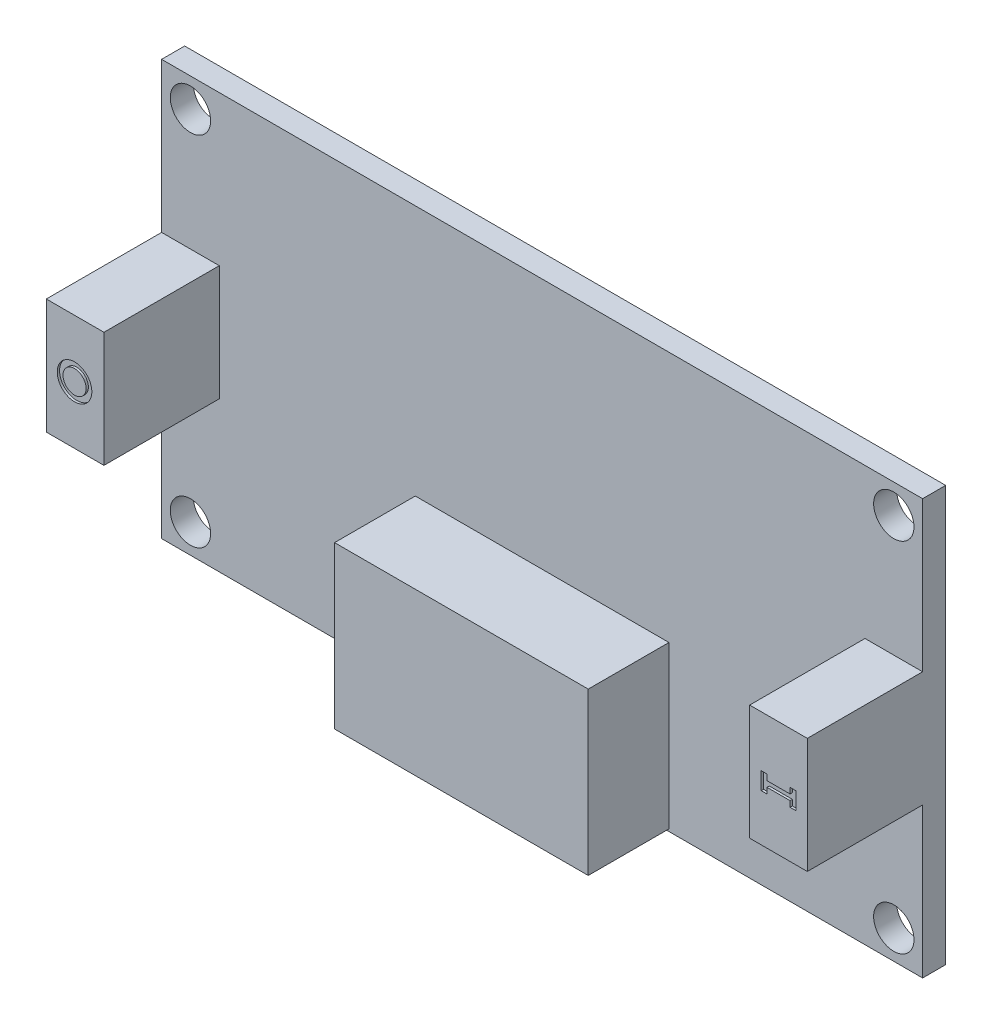
ISO-10303-21;
HEADER;
FILE_DESCRIPTION(('STEP AP214'),'2;1');
FILE_NAME('part.step','',(''),(''),'','','');
FILE_SCHEMA(('AUTOMOTIVE_DESIGN { 1 0 10303 214 1 1 1 1 }'));
ENDSEC;
DATA;
#1=APPLICATION_CONTEXT('core data for automotive mechanical design processes');
#2=APPLICATION_PROTOCOL_DEFINITION('international standard','automotive_design',2000,#1);
#3=PRODUCT_CONTEXT('',#1,'mechanical');
#4=PRODUCT('Part','Part','',(#3));
#5=PRODUCT_RELATED_PRODUCT_CATEGORY('part','',(#4));
#6=PRODUCT_DEFINITION_FORMATION('','',#4);
#7=PRODUCT_DEFINITION_CONTEXT('part definition',#1,'design');
#8=PRODUCT_DEFINITION('design','',#6,#7);
#9=PRODUCT_DEFINITION_SHAPE('','',#8);
#10=(LENGTH_UNIT() NAMED_UNIT(*) SI_UNIT(.MILLI.,.METRE.));
#11=(NAMED_UNIT(*) PLANE_ANGLE_UNIT() SI_UNIT($,.RADIAN.));
#12=(NAMED_UNIT(*) SI_UNIT($,.STERADIAN.) SOLID_ANGLE_UNIT());
#13=UNCERTAINTY_MEASURE_WITH_UNIT(LENGTH_MEASURE(1.E-05),#10,'distance_accuracy_value','');
#14=(GEOMETRIC_REPRESENTATION_CONTEXT(3) GLOBAL_UNCERTAINTY_ASSIGNED_CONTEXT((#13)) GLOBAL_UNIT_ASSIGNED_CONTEXT((#10,
#11,#12)) REPRESENTATION_CONTEXT('',''));
#15=CARTESIAN_POINT('',(0.,0.,0.));
#16=DIRECTION('',(0.,0.,1.));
#17=DIRECTION('',(1.,0.,0.));
#18=AXIS2_PLACEMENT_3D('',#15,#16,#17);
#19=CARTESIAN_POINT('',(0.,0.,2.));
#20=DIRECTION('',(0.,0.,-1.));
#21=DIRECTION('',(-1.,0.,0.));
#22=AXIS2_PLACEMENT_3D('',#19,#20,#21);
#23=PLANE('',#22);
#24=CARTESIAN_POINT('',(-30.5,15.5,2.));
#25=DIRECTION('',(0.,0.,1.));
#26=DIRECTION('',(-1.,0.,0.));
#27=AXIS2_PLACEMENT_3D('',#24,#25,#26);
#28=CIRCLE('',#27,1.75);
#29=CARTESIAN_POINT('',(-32.25,15.5,2.));
#30=VERTEX_POINT('',#29);
#31=EDGE_CURVE('E417',#30,#30,#28,.T.);
#32=ORIENTED_EDGE('',*,*,#31,.F.);
#33=EDGE_LOOP('',(#32));
#34=FACE_BOUND('',#33,.T.);
#35=CARTESIAN_POINT('',(-30.5,-15.5,2.));
#36=DIRECTION('',(0.,0.,1.));
#37=DIRECTION('',(1.,0.,0.));
#38=AXIS2_PLACEMENT_3D('',#35,#36,#37);
#39=CIRCLE('',#38,1.75);
#40=CARTESIAN_POINT('',(-28.75,-15.5,2.));
#41=VERTEX_POINT('',#40);
#42=EDGE_CURVE('E423',#41,#41,#39,.T.);
#43=ORIENTED_EDGE('',*,*,#42,.F.);
#44=EDGE_LOOP('',(#43));
#45=FACE_BOUND('',#44,.T.);
#46=CARTESIAN_POINT('',(30.5,-15.5,2.));
#47=DIRECTION('',(0.,0.,1.));
#48=DIRECTION('',(-1.,0.,0.));
#49=AXIS2_PLACEMENT_3D('',#46,#47,#48);
#50=CIRCLE('',#49,1.75);
#51=CARTESIAN_POINT('',(28.75,-15.5,2.));
#52=VERTEX_POINT('',#51);
#53=EDGE_CURVE('E429',#52,#52,#50,.T.);
#54=ORIENTED_EDGE('',*,*,#53,.F.);
#55=EDGE_LOOP('',(#54));
#56=FACE_BOUND('',#55,.T.);
#57=CARTESIAN_POINT('',(30.5,15.5,2.));
#58=DIRECTION('',(0.,0.,1.));
#59=DIRECTION('',(1.,0.,0.));
#60=AXIS2_PLACEMENT_3D('',#57,#58,#59);
#61=CIRCLE('',#60,1.75);
#62=CARTESIAN_POINT('',(32.25,15.5,2.));
#63=VERTEX_POINT('',#62);
#64=EDGE_CURVE('E435',#63,#63,#61,.T.);
#65=ORIENTED_EDGE('',*,*,#64,.F.);
#66=EDGE_LOOP('',(#65));
#67=FACE_BOUND('',#66,.T.);
#68=DIRECTION('',(0.,1.,0.));
#69=VECTOR('',#68,1.);
#70=CARTESIAN_POINT('',(11.,-17.8,2.));
#71=LINE('',#70,#69);
#72=CARTESIAN_POINT('',(11.,-17.8,2.));
#73=VERTEX_POINT('',#72);
#74=CARTESIAN_POINT('',(11.,-3.79999999999999,2.));
#75=VERTEX_POINT('',#74);
#76=EDGE_CURVE('E383',#73,#75,#71,.T.);
#77=ORIENTED_EDGE('',*,*,#76,.F.);
#78=DIRECTION('',(1.,0.,0.));
#79=VECTOR('',#78,1.);
#80=CARTESIAN_POINT('',(-11.,-17.8,2.));
#81=LINE('',#80,#79);
#82=CARTESIAN_POINT('',(-11.,-17.8,2.));
#83=VERTEX_POINT('',#82);
#84=EDGE_CURVE('E388',#83,#73,#81,.T.);
#85=ORIENTED_EDGE('',*,*,#84,.F.);
#86=DIRECTION('',(0.,-1.,0.));
#87=VECTOR('',#86,1.);
#88=CARTESIAN_POINT('',(-11.,-17.8,2.));
#89=LINE('',#88,#87);
#90=CARTESIAN_POINT('',(-11.,-3.79999999999999,2.));
#91=VERTEX_POINT('',#90);
#92=EDGE_CURVE('E400',#91,#83,#89,.T.);
#93=ORIENTED_EDGE('',*,*,#92,.F.);
#94=DIRECTION('',(-1.,0.,0.));
#95=VECTOR('',#94,1.);
#96=CARTESIAN_POINT('',(-11.,-3.79999999999999,2.));
#97=LINE('',#96,#95);
#98=EDGE_CURVE('E397',#75,#91,#97,.T.);
#99=ORIENTED_EDGE('',*,*,#98,.F.);
#100=EDGE_LOOP('',(#77,#85,#93,#99));
#101=FACE_BOUND('',#100,.T.);
#102=DIRECTION('',(-1.,0.,0.));
#103=VECTOR('',#102,1.);
#104=CARTESIAN_POINT('',(28.,5.,2.));
#105=LINE('',#104,#103);
#106=CARTESIAN_POINT('',(33.,5.,2.));
#107=VERTEX_POINT('',#106);
#108=CARTESIAN_POINT('',(28.,5.,2.));
#109=VERTEX_POINT('',#108);
#110=EDGE_CURVE('E307',#107,#109,#105,.T.);
#111=ORIENTED_EDGE('',*,*,#110,.F.);
#112=DIRECTION('',(0.,1.,0.));
#113=VECTOR('',#112,1.);
#114=CARTESIAN_POINT('',(33.,-18.,2.));
#115=LINE('',#114,#113);
#116=CARTESIAN_POINT('',(33.,18.,2.));
#117=VERTEX_POINT('',#116);
#118=EDGE_CURVE('E444',#107,#117,#115,.T.);
#119=ORIENTED_EDGE('',*,*,#118,.T.);
#120=DIRECTION('',(-1.,0.,0.));
#121=VECTOR('',#120,1.);
#122=CARTESIAN_POINT('',(-33.,18.,2.));
#123=LINE('',#122,#121);
#124=CARTESIAN_POINT('',(-33.,18.,2.));
#125=VERTEX_POINT('',#124);
#126=EDGE_CURVE('E443',#117,#125,#123,.T.);
#127=ORIENTED_EDGE('',*,*,#126,.T.);
#128=DIRECTION('',(0.,-1.,0.));
#129=VECTOR('',#128,1.);
#130=CARTESIAN_POINT('',(-33.,-18.,2.));
#131=LINE('',#130,#129);
#132=CARTESIAN_POINT('',(-33.,5.,2.));
#133=VERTEX_POINT('',#132);
#134=EDGE_CURVE('E447',#125,#133,#131,.T.);
#135=ORIENTED_EDGE('',*,*,#134,.T.);
#136=DIRECTION('',(-1.,0.,0.));
#137=VECTOR('',#136,1.);
#138=CARTESIAN_POINT('',(-33.,5.,2.));
#139=LINE('',#138,#137);
#140=CARTESIAN_POINT('',(-28.,5.,2.));
#141=VERTEX_POINT('',#140);
#142=EDGE_CURVE('E367',#141,#133,#139,.T.);
#143=ORIENTED_EDGE('',*,*,#142,.F.);
#144=DIRECTION('',(0.,1.,0.));
#145=VECTOR('',#144,1.);
#146=CARTESIAN_POINT('',(-28.,5.,2.));
#147=LINE('',#146,#145);
#148=CARTESIAN_POINT('',(-28.,-5.,2.));
#149=VERTEX_POINT('',#148);
#150=EDGE_CURVE('E353',#149,#141,#147,.T.);
#151=ORIENTED_EDGE('',*,*,#150,.F.);
#152=DIRECTION('',(1.,0.,0.));
#153=VECTOR('',#152,1.);
#154=CARTESIAN_POINT('',(-33.,-5.,2.));
#155=LINE('',#154,#153);
#156=CARTESIAN_POINT('',(-33.,-5.,2.));
#157=VERTEX_POINT('',#156);
#158=EDGE_CURVE('E358',#157,#149,#155,.T.);
#159=ORIENTED_EDGE('',*,*,#158,.F.);
#160=CARTESIAN_POINT('',(-33.,-18.,2.));
#161=VERTEX_POINT('',#160);
#162=EDGE_CURVE('E446',#157,#161,#131,.T.);
#163=ORIENTED_EDGE('',*,*,#162,.T.);
#164=DIRECTION('',(1.,0.,0.));
#165=VECTOR('',#164,1.);
#166=CARTESIAN_POINT('',(-33.,-18.,2.));
#167=LINE('',#166,#165);
#168=CARTESIAN_POINT('',(33.,-18.,2.));
#169=VERTEX_POINT('',#168);
#170=EDGE_CURVE('E449',#161,#169,#167,.T.);
#171=ORIENTED_EDGE('',*,*,#170,.T.);
#172=CARTESIAN_POINT('',(33.,-5.,2.));
#173=VERTEX_POINT('',#172);
#174=EDGE_CURVE('E441',#169,#173,#115,.T.);
#175=ORIENTED_EDGE('',*,*,#174,.T.);
#176=DIRECTION('',(1.,0.,0.));
#177=VECTOR('',#176,1.);
#178=CARTESIAN_POINT('',(28.,-5.,2.));
#179=LINE('',#178,#177);
#180=CARTESIAN_POINT('',(28.,-5.,2.));
#181=VERTEX_POINT('',#180);
#182=EDGE_CURVE('E331',#181,#173,#179,.T.);
#183=ORIENTED_EDGE('',*,*,#182,.F.);
#184=DIRECTION('',(0.,-1.,0.));
#185=VECTOR('',#184,1.);
#186=CARTESIAN_POINT('',(28.,5.,2.));
#187=LINE('',#186,#185);
#188=EDGE_CURVE('E57',#109,#181,#187,.T.);
#189=ORIENTED_EDGE('',*,*,#188,.F.);
#190=EDGE_LOOP('',(#111,#119,#127,#135,#143,#151,#159,#163,#171,#175,#183,#189));
#191=FACE_BOUND('',#190,.T.);
#192=ADVANCED_FACE('F34',(#34,#45,#56,#67,#101,#191),#23,.F.);
#193=CARTESIAN_POINT('',(0.,0.,0.));
#194=DIRECTION('',(0.,0.,-1.));
#195=DIRECTION('',(-1.,0.,0.));
#196=AXIS2_PLACEMENT_3D('',#193,#194,#195);
#197=PLANE('',#196);
#198=CARTESIAN_POINT('',(-30.5,-15.5,0.));
#199=DIRECTION('',(0.,0.,1.));
#200=DIRECTION('',(1.,0.,0.));
#201=AXIS2_PLACEMENT_3D('',#198,#199,#200);
#202=CIRCLE('',#201,1.75);
#203=CARTESIAN_POINT('',(-28.75,-15.5,0.));
#204=VERTEX_POINT('',#203);
#205=EDGE_CURVE('E420',#204,#204,#202,.T.);
#206=ORIENTED_EDGE('',*,*,#205,.T.);
#207=EDGE_LOOP('',(#206));
#208=FACE_BOUND('',#207,.T.);
#209=CARTESIAN_POINT('',(30.5,15.5,0.));
#210=DIRECTION('',(0.,0.,1.));
#211=DIRECTION('',(1.,0.,0.));
#212=AXIS2_PLACEMENT_3D('',#209,#210,#211);
#213=CIRCLE('',#212,1.75);
#214=CARTESIAN_POINT('',(32.25,15.5,0.));
#215=VERTEX_POINT('',#214);
#216=EDGE_CURVE('E432',#215,#215,#213,.T.);
#217=ORIENTED_EDGE('',*,*,#216,.T.);
#218=EDGE_LOOP('',(#217));
#219=FACE_BOUND('',#218,.T.);
#220=DIRECTION('',(0.,1.,0.));
#221=VECTOR('',#220,1.);
#222=CARTESIAN_POINT('',(33.,-18.,0.));
#223=LINE('',#222,#221);
#224=CARTESIAN_POINT('',(33.,-18.,0.));
#225=VERTEX_POINT('',#224);
#226=CARTESIAN_POINT('',(33.,18.,0.));
#227=VERTEX_POINT('',#226);
#228=EDGE_CURVE('E438',#225,#227,#223,.T.);
#229=ORIENTED_EDGE('',*,*,#228,.F.);
#230=DIRECTION('',(1.,0.,0.));
#231=VECTOR('',#230,1.);
#232=CARTESIAN_POINT('',(-33.,-18.,0.));
#233=LINE('',#232,#231);
#234=CARTESIAN_POINT('',(-33.,-18.,0.));
#235=VERTEX_POINT('',#234);
#236=EDGE_CURVE('E458',#235,#225,#233,.T.);
#237=ORIENTED_EDGE('',*,*,#236,.F.);
#238=DIRECTION('',(0.,-1.,0.));
#239=VECTOR('',#238,1.);
#240=CARTESIAN_POINT('',(-33.,-18.,0.));
#241=LINE('',#240,#239);
#242=CARTESIAN_POINT('',(-33.,18.,0.));
#243=VERTEX_POINT('',#242);
#244=EDGE_CURVE('E456',#243,#235,#241,.T.);
#245=ORIENTED_EDGE('',*,*,#244,.F.);
#246=DIRECTION('',(-1.,0.,0.));
#247=VECTOR('',#246,1.);
#248=CARTESIAN_POINT('',(-33.,18.,0.));
#249=LINE('',#248,#247);
#250=EDGE_CURVE('E454',#227,#243,#249,.T.);
#251=ORIENTED_EDGE('',*,*,#250,.F.);
#252=EDGE_LOOP('',(#229,#237,#245,#251));
#253=FACE_BOUND('',#252,.T.);
#254=CARTESIAN_POINT('',(30.5,-15.5,0.));
#255=DIRECTION('',(0.,0.,1.));
#256=DIRECTION('',(-1.,0.,0.));
#257=AXIS2_PLACEMENT_3D('',#254,#255,#256);
#258=CIRCLE('',#257,1.75);
#259=CARTESIAN_POINT('',(28.75,-15.5,0.));
#260=VERTEX_POINT('',#259);
#261=EDGE_CURVE('E426',#260,#260,#258,.T.);
#262=ORIENTED_EDGE('',*,*,#261,.T.);
#263=EDGE_LOOP('',(#262));
#264=FACE_BOUND('',#263,.T.);
#265=CARTESIAN_POINT('',(-30.5,15.5,0.));
#266=DIRECTION('',(0.,0.,1.));
#267=DIRECTION('',(-1.,0.,0.));
#268=AXIS2_PLACEMENT_3D('',#265,#266,#267);
#269=CIRCLE('',#268,1.75);
#270=CARTESIAN_POINT('',(-32.25,15.5,0.));
#271=VERTEX_POINT('',#270);
#272=EDGE_CURVE('E416',#271,#271,#269,.T.);
#273=ORIENTED_EDGE('',*,*,#272,.T.);
#274=EDGE_LOOP('',(#273));
#275=FACE_BOUND('',#274,.T.);
#276=ADVANCED_FACE('F476',(#208,#219,#253,#264,#275),#197,.T.);
#277=CARTESIAN_POINT('',(33.,-18.,2.));
#278=DIRECTION('',(-1.,0.,0.));
#279=DIRECTION('',(0.,0.,1.));
#280=AXIS2_PLACEMENT_3D('',#277,#278,#279);
#281=PLANE('',#280);
#282=ORIENTED_EDGE('',*,*,#228,.T.);
#283=DIRECTION('',(0.,0.,-1.));
#284=VECTOR('',#283,1.);
#285=CARTESIAN_POINT('',(33.,18.,2.));
#286=LINE('',#285,#284);
#287=EDGE_CURVE('E11',#117,#227,#286,.T.);
#288=ORIENTED_EDGE('',*,*,#287,.F.);
#289=ORIENTED_EDGE('',*,*,#118,.F.);
#290=DIRECTION('',(0.,0.,-1.));
#291=VECTOR('',#290,1.);
#292=CARTESIAN_POINT('',(33.,5.,12.));
#293=LINE('',#292,#291);
#294=CARTESIAN_POINT('',(33.,5.,12.));
#295=VERTEX_POINT('',#294);
#296=EDGE_CURVE('E350',#295,#107,#293,.T.);
#297=ORIENTED_EDGE('',*,*,#296,.F.);
#298=DIRECTION('',(0.,1.,0.));
#299=VECTOR('',#298,1.);
#300=CARTESIAN_POINT('',(33.,5.,12.));
#301=LINE('',#300,#299);
#302=CARTESIAN_POINT('',(33.,-5.,12.));
#303=VERTEX_POINT('',#302);
#304=EDGE_CURVE('E327',#303,#295,#301,.T.);
#305=ORIENTED_EDGE('',*,*,#304,.F.);
#306=DIRECTION('',(0.,0.,-1.));
#307=VECTOR('',#306,1.);
#308=CARTESIAN_POINT('',(33.,-5.,12.));
#309=LINE('',#308,#307);
#310=EDGE_CURVE('E337',#303,#173,#309,.T.);
#311=ORIENTED_EDGE('',*,*,#310,.T.);
#312=ORIENTED_EDGE('',*,*,#174,.F.);
#313=DIRECTION('',(0.,0.,-1.));
#314=VECTOR('',#313,1.);
#315=CARTESIAN_POINT('',(33.,-18.,2.));
#316=LINE('',#315,#314);
#317=EDGE_CURVE('E451',#169,#225,#316,.T.);
#318=ORIENTED_EDGE('',*,*,#317,.T.);
#319=EDGE_LOOP('',(#282,#288,#289,#297,#305,#311,#312,#318));
#320=FACE_BOUND('',#319,.T.);
#321=ADVANCED_FACE('F36',(#320),#281,.F.);
#322=CARTESIAN_POINT('',(-33.,18.,2.));
#323=DIRECTION('',(0.,-1.,0.));
#324=DIRECTION('',(0.,0.,-1.));
#325=AXIS2_PLACEMENT_3D('',#322,#323,#324);
#326=PLANE('',#325);
#327=ORIENTED_EDGE('',*,*,#250,.T.);
#328=DIRECTION('',(0.,0.,-1.));
#329=VECTOR('',#328,1.);
#330=CARTESIAN_POINT('',(-33.,18.,2.));
#331=LINE('',#330,#329);
#332=EDGE_CURVE('E42',#125,#243,#331,.T.);
#333=ORIENTED_EDGE('',*,*,#332,.F.);
#334=ORIENTED_EDGE('',*,*,#126,.F.);
#335=ORIENTED_EDGE('',*,*,#287,.T.);
#336=EDGE_LOOP('',(#327,#333,#334,#335));
#337=FACE_BOUND('',#336,.T.);
#338=ADVANCED_FACE('F498',(#337),#326,.F.);
#339=CARTESIAN_POINT('',(-33.,-18.,2.));
#340=DIRECTION('',(1.,0.,0.));
#341=DIRECTION('',(0.,0.,-1.));
#342=AXIS2_PLACEMENT_3D('',#339,#340,#341);
#343=PLANE('',#342);
#344=ORIENTED_EDGE('',*,*,#244,.T.);
#345=DIRECTION('',(0.,0.,-1.));
#346=VECTOR('',#345,1.);
#347=CARTESIAN_POINT('',(-33.,-18.,2.));
#348=LINE('',#347,#346);
#349=EDGE_CURVE('E462',#161,#235,#348,.T.);
#350=ORIENTED_EDGE('',*,*,#349,.F.);
#351=ORIENTED_EDGE('',*,*,#162,.F.);
#352=DIRECTION('',(0.,0.,-1.));
#353=VECTOR('',#352,1.);
#354=CARTESIAN_POINT('',(-33.,-5.,12.));
#355=LINE('',#354,#353);
#356=CARTESIAN_POINT('',(-33.,-5.,12.));
#357=VERTEX_POINT('',#356);
#358=EDGE_CURVE('E374',#357,#157,#355,.T.);
#359=ORIENTED_EDGE('',*,*,#358,.F.);
#360=DIRECTION('',(0.,-1.,0.));
#361=VECTOR('',#360,1.);
#362=CARTESIAN_POINT('',(-33.,5.,12.));
#363=LINE('',#362,#361);
#364=CARTESIAN_POINT('',(-33.,5.,12.));
#365=VERTEX_POINT('',#364);
#366=EDGE_CURVE('E360',#365,#357,#363,.T.);
#367=ORIENTED_EDGE('',*,*,#366,.F.);
#368=DIRECTION('',(0.,0.,-1.));
#369=VECTOR('',#368,1.);
#370=CARTESIAN_POINT('',(-33.,5.,12.));
#371=LINE('',#370,#369);
#372=EDGE_CURVE('E377',#365,#133,#371,.T.);
#373=ORIENTED_EDGE('',*,*,#372,.T.);
#374=ORIENTED_EDGE('',*,*,#134,.F.);
#375=ORIENTED_EDGE('',*,*,#332,.T.);
#376=EDGE_LOOP('',(#344,#350,#351,#359,#367,#373,#374,#375));
#377=FACE_BOUND('',#376,.T.);
#378=ADVANCED_FACE('F469',(#377),#343,.F.);
#379=CARTESIAN_POINT('',(-33.,-18.,2.));
#380=DIRECTION('',(0.,1.,0.));
#381=DIRECTION('',(0.,0.,1.));
#382=AXIS2_PLACEMENT_3D('',#379,#380,#381);
#383=PLANE('',#382);
#384=ORIENTED_EDGE('',*,*,#236,.T.);
#385=ORIENTED_EDGE('',*,*,#317,.F.);
#386=ORIENTED_EDGE('',*,*,#170,.F.);
#387=ORIENTED_EDGE('',*,*,#349,.T.);
#388=EDGE_LOOP('',(#384,#385,#386,#387));
#389=FACE_BOUND('',#388,.T.);
#390=ADVANCED_FACE('F480',(#389),#383,.F.);
#391=CARTESIAN_POINT('',(30.5,15.5,2.));
#392=DIRECTION('',(0.,0.,-1.));
#393=DIRECTION('',(-1.,0.,0.));
#394=AXIS2_PLACEMENT_3D('',#391,#392,#393);
#395=CYLINDRICAL_SURFACE('',#394,1.75);
#396=ORIENTED_EDGE('',*,*,#64,.T.);
#397=EDGE_LOOP('',(#396));
#398=FACE_BOUND('',#397,.T.);
#399=ORIENTED_EDGE('',*,*,#216,.F.);
#400=EDGE_LOOP('',(#399));
#401=FACE_BOUND('',#400,.T.);
#402=ADVANCED_FACE('F516',(#398,#401),#395,.F.);
#403=CARTESIAN_POINT('',(30.5,-15.5,2.));
#404=DIRECTION('',(0.,0.,-1.));
#405=DIRECTION('',(-1.,0.,0.));
#406=AXIS2_PLACEMENT_3D('',#403,#404,#405);
#407=CYLINDRICAL_SURFACE('',#406,1.75);
#408=ORIENTED_EDGE('',*,*,#53,.T.);
#409=EDGE_LOOP('',(#408));
#410=FACE_BOUND('',#409,.T.);
#411=ORIENTED_EDGE('',*,*,#261,.F.);
#412=EDGE_LOOP('',(#411));
#413=FACE_BOUND('',#412,.T.);
#414=ADVANCED_FACE('F523',(#410,#413),#407,.F.);
#415=CARTESIAN_POINT('',(-30.5,-15.5,2.));
#416=DIRECTION('',(0.,0.,-1.));
#417=DIRECTION('',(-1.,0.,0.));
#418=AXIS2_PLACEMENT_3D('',#415,#416,#417);
#419=CYLINDRICAL_SURFACE('',#418,1.75);
#420=ORIENTED_EDGE('',*,*,#42,.T.);
#421=EDGE_LOOP('',(#420));
#422=FACE_BOUND('',#421,.T.);
#423=ORIENTED_EDGE('',*,*,#205,.F.);
#424=EDGE_LOOP('',(#423));
#425=FACE_BOUND('',#424,.T.);
#426=ADVANCED_FACE('F528',(#422,#425),#419,.F.);
#427=CARTESIAN_POINT('',(-30.5,15.5,2.));
#428=DIRECTION('',(0.,0.,-1.));
#429=DIRECTION('',(-1.,0.,0.));
#430=AXIS2_PLACEMENT_3D('',#427,#428,#429);
#431=CYLINDRICAL_SURFACE('',#430,1.75);
#432=ORIENTED_EDGE('',*,*,#31,.T.);
#433=EDGE_LOOP('',(#432));
#434=FACE_BOUND('',#433,.T.);
#435=ORIENTED_EDGE('',*,*,#272,.F.);
#436=EDGE_LOOP('',(#435));
#437=FACE_BOUND('',#436,.T.);
#438=ADVANCED_FACE('F560',(#434,#437),#431,.F.);
#439=CARTESIAN_POINT('',(11.,-17.8,9.));
#440=DIRECTION('',(-1.,0.,0.));
#441=DIRECTION('',(0.,0.,1.));
#442=AXIS2_PLACEMENT_3D('',#439,#440,#441);
#443=PLANE('',#442);
#444=ORIENTED_EDGE('',*,*,#76,.T.);
#445=DIRECTION('',(0.,0.,-1.));
#446=VECTOR('',#445,1.);
#447=CARTESIAN_POINT('',(11.,-3.79999999999999,9.));
#448=LINE('',#447,#446);
#449=CARTESIAN_POINT('',(11.,-3.79999999999999,9.));
#450=VERTEX_POINT('',#449);
#451=EDGE_CURVE('E413',#450,#75,#448,.T.);
#452=ORIENTED_EDGE('',*,*,#451,.F.);
#453=DIRECTION('',(0.,1.,0.));
#454=VECTOR('',#453,1.);
#455=CARTESIAN_POINT('',(11.,-17.8,9.));
#456=LINE('',#455,#454);
#457=CARTESIAN_POINT('',(11.,-17.8,9.));
#458=VERTEX_POINT('',#457);
#459=EDGE_CURVE('E384',#458,#450,#456,.T.);
#460=ORIENTED_EDGE('',*,*,#459,.F.);
#461=DIRECTION('',(0.,0.,-1.));
#462=VECTOR('',#461,1.);
#463=CARTESIAN_POINT('',(11.,-17.8,9.));
#464=LINE('',#463,#462);
#465=EDGE_CURVE('E394',#458,#73,#464,.T.);
#466=ORIENTED_EDGE('',*,*,#465,.T.);
#467=EDGE_LOOP('',(#444,#452,#460,#466));
#468=FACE_BOUND('',#467,.T.);
#469=ADVANCED_FACE('F544',(#468),#443,.F.);
#470=CARTESIAN_POINT('',(-11.,-3.79999999999999,9.));
#471=DIRECTION('',(0.,-1.,0.));
#472=DIRECTION('',(0.,0.,-1.));
#473=AXIS2_PLACEMENT_3D('',#470,#471,#472);
#474=PLANE('',#473);
#475=ORIENTED_EDGE('',*,*,#98,.T.);
#476=DIRECTION('',(0.,0.,-1.));
#477=VECTOR('',#476,1.);
#478=CARTESIAN_POINT('',(-11.,-3.79999999999999,9.));
#479=LINE('',#478,#477);
#480=CARTESIAN_POINT('',(-11.,-3.79999999999999,9.));
#481=VERTEX_POINT('',#480);
#482=EDGE_CURVE('E410',#481,#91,#479,.T.);
#483=ORIENTED_EDGE('',*,*,#482,.F.);
#484=DIRECTION('',(-1.,0.,0.));
#485=VECTOR('',#484,1.);
#486=CARTESIAN_POINT('',(-11.,-3.79999999999999,9.));
#487=LINE('',#486,#485);
#488=EDGE_CURVE('E387',#450,#481,#487,.T.);
#489=ORIENTED_EDGE('',*,*,#488,.F.);
#490=ORIENTED_EDGE('',*,*,#451,.T.);
#491=EDGE_LOOP('',(#475,#483,#489,#490));
#492=FACE_BOUND('',#491,.T.);
#493=ADVANCED_FACE('F552',(#492),#474,.F.);
#494=CARTESIAN_POINT('',(-11.,-17.8,9.));
#495=DIRECTION('',(1.,0.,0.));
#496=DIRECTION('',(0.,0.,-1.));
#497=AXIS2_PLACEMENT_3D('',#494,#495,#496);
#498=PLANE('',#497);
#499=ORIENTED_EDGE('',*,*,#92,.T.);
#500=DIRECTION('',(0.,0.,-1.));
#501=VECTOR('',#500,1.);
#502=CARTESIAN_POINT('',(-11.,-17.8,9.));
#503=LINE('',#502,#501);
#504=CARTESIAN_POINT('',(-11.,-17.8,9.));
#505=VERTEX_POINT('',#504);
#506=EDGE_CURVE('E407',#505,#83,#503,.T.);
#507=ORIENTED_EDGE('',*,*,#506,.F.);
#508=DIRECTION('',(0.,-1.,0.));
#509=VECTOR('',#508,1.);
#510=CARTESIAN_POINT('',(-11.,-17.8,9.));
#511=LINE('',#510,#509);
#512=EDGE_CURVE('E390',#481,#505,#511,.T.);
#513=ORIENTED_EDGE('',*,*,#512,.F.);
#514=ORIENTED_EDGE('',*,*,#482,.T.);
#515=EDGE_LOOP('',(#499,#507,#513,#514));
#516=FACE_BOUND('',#515,.T.);
#517=ADVANCED_FACE('F550',(#516),#498,.F.);
#518=CARTESIAN_POINT('',(-11.,-17.8,9.));
#519=DIRECTION('',(0.,1.,0.));
#520=DIRECTION('',(0.,0.,1.));
#521=AXIS2_PLACEMENT_3D('',#518,#519,#520);
#522=PLANE('',#521);
#523=ORIENTED_EDGE('',*,*,#84,.T.);
#524=ORIENTED_EDGE('',*,*,#465,.F.);
#525=DIRECTION('',(1.,0.,0.));
#526=VECTOR('',#525,1.);
#527=CARTESIAN_POINT('',(-11.,-17.8,9.));
#528=LINE('',#527,#526);
#529=EDGE_CURVE('E392',#505,#458,#528,.T.);
#530=ORIENTED_EDGE('',*,*,#529,.F.);
#531=ORIENTED_EDGE('',*,*,#506,.T.);
#532=EDGE_LOOP('',(#523,#524,#530,#531));
#533=FACE_BOUND('',#532,.T.);
#534=ADVANCED_FACE('F540',(#533),#522,.F.);
#535=CARTESIAN_POINT('',(0.,0.,9.));
#536=DIRECTION('',(0.,0.,-1.));
#537=DIRECTION('',(-1.,0.,0.));
#538=AXIS2_PLACEMENT_3D('',#535,#536,#537);
#539=PLANE('',#538);
#540=ORIENTED_EDGE('',*,*,#459,.T.);
#541=ORIENTED_EDGE('',*,*,#488,.T.);
#542=ORIENTED_EDGE('',*,*,#512,.T.);
#543=ORIENTED_EDGE('',*,*,#529,.T.);
#544=EDGE_LOOP('',(#540,#541,#542,#543));
#545=FACE_BOUND('',#544,.T.);
#546=ADVANCED_FACE('F546',(#545),#539,.F.);
#547=CARTESIAN_POINT('',(-28.,5.,12.));
#548=DIRECTION('',(-1.,0.,0.));
#549=DIRECTION('',(0.,0.,1.));
#550=AXIS2_PLACEMENT_3D('',#547,#548,#549);
#551=PLANE('',#550);
#552=ORIENTED_EDGE('',*,*,#150,.T.);
#553=DIRECTION('',(0.,0.,-1.));
#554=VECTOR('',#553,1.);
#555=CARTESIAN_POINT('',(-28.,5.,12.));
#556=LINE('',#555,#554);
#557=CARTESIAN_POINT('',(-28.,5.,12.));
#558=VERTEX_POINT('',#557);
#559=EDGE_CURVE('E380',#558,#141,#556,.T.);
#560=ORIENTED_EDGE('',*,*,#559,.F.);
#561=DIRECTION('',(0.,1.,0.));
#562=VECTOR('',#561,1.);
#563=CARTESIAN_POINT('',(-28.,5.,12.));
#564=LINE('',#563,#562);
#565=CARTESIAN_POINT('',(-28.,-5.,12.));
#566=VERTEX_POINT('',#565);
#567=EDGE_CURVE('E354',#566,#558,#564,.T.);
#568=ORIENTED_EDGE('',*,*,#567,.F.);
#569=DIRECTION('',(0.,0.,-1.));
#570=VECTOR('',#569,1.);
#571=CARTESIAN_POINT('',(-28.,-5.,12.));
#572=LINE('',#571,#570);
#573=EDGE_CURVE('E364',#566,#149,#572,.T.);
#574=ORIENTED_EDGE('',*,*,#573,.T.);
#575=EDGE_LOOP('',(#552,#560,#568,#574));
#576=FACE_BOUND('',#575,.T.);
#577=ADVANCED_FACE('F616',(#576),#551,.F.);
#578=CARTESIAN_POINT('',(-33.,5.,12.));
#579=DIRECTION('',(0.,-1.,0.));
#580=DIRECTION('',(0.,0.,-1.));
#581=AXIS2_PLACEMENT_3D('',#578,#579,#580);
#582=PLANE('',#581);
#583=ORIENTED_EDGE('',*,*,#142,.T.);
#584=ORIENTED_EDGE('',*,*,#372,.F.);
#585=DIRECTION('',(-1.,0.,0.));
#586=VECTOR('',#585,1.);
#587=CARTESIAN_POINT('',(-33.,5.,12.));
#588=LINE('',#587,#586);
#589=EDGE_CURVE('E357',#558,#365,#588,.T.);
#590=ORIENTED_EDGE('',*,*,#589,.F.);
#591=ORIENTED_EDGE('',*,*,#559,.T.);
#592=EDGE_LOOP('',(#583,#584,#590,#591));
#593=FACE_BOUND('',#592,.T.);
#594=ADVANCED_FACE('F644',(#593),#582,.F.);
#595=CARTESIAN_POINT('',(-33.,-5.,12.));
#596=DIRECTION('',(0.,1.,0.));
#597=DIRECTION('',(0.,0.,1.));
#598=AXIS2_PLACEMENT_3D('',#595,#596,#597);
#599=PLANE('',#598);
#600=ORIENTED_EDGE('',*,*,#158,.T.);
#601=ORIENTED_EDGE('',*,*,#573,.F.);
#602=DIRECTION('',(1.,0.,0.));
#603=VECTOR('',#602,1.);
#604=CARTESIAN_POINT('',(-33.,-5.,12.));
#605=LINE('',#604,#603);
#606=EDGE_CURVE('E362',#357,#566,#605,.T.);
#607=ORIENTED_EDGE('',*,*,#606,.F.);
#608=ORIENTED_EDGE('',*,*,#358,.T.);
#609=EDGE_LOOP('',(#600,#601,#607,#608));
#610=FACE_BOUND('',#609,.T.);
#611=ADVANCED_FACE('F654',(#610),#599,.F.);
#612=CARTESIAN_POINT('',(0.,0.,12.));
#613=DIRECTION('',(0.,0.,1.));
#614=DIRECTION('',(1.,0.,0.));
#615=AXIS2_PLACEMENT_3D('',#612,#613,#614);
#616=PLANE('',#615);
#617=CARTESIAN_POINT('',(-30.5516184550516,0.,12.));
#618=DIRECTION('',(0.,0.,1.));
#619=DIRECTION('',(1.,0.,0.));
#620=AXIS2_PLACEMENT_3D('',#617,#618,#619);
#621=CIRCLE('',#620,1.5);
#622=CARTESIAN_POINT('',(-29.0516184550516,0.,12.));
#623=VERTEX_POINT('',#622);
#624=EDGE_CURVE('E247',#623,#623,#621,.T.);
#625=ORIENTED_EDGE('',*,*,#624,.F.);
#626=EDGE_LOOP('',(#625));
#627=FACE_BOUND('',#626,.T.);
#628=ORIENTED_EDGE('',*,*,#567,.T.);
#629=ORIENTED_EDGE('',*,*,#589,.T.);
#630=ORIENTED_EDGE('',*,*,#366,.T.);
#631=ORIENTED_EDGE('',*,*,#606,.T.);
#632=EDGE_LOOP('',(#628,#629,#630,#631));
#633=FACE_BOUND('',#632,.T.);
#634=ADVANCED_FACE('F664',(#627,#633),#616,.T.);
#635=CARTESIAN_POINT('',(28.,5.,12.));
#636=DIRECTION('',(0.,-1.,0.));
#637=DIRECTION('',(0.,0.,-1.));
#638=AXIS2_PLACEMENT_3D('',#635,#636,#637);
#639=PLANE('',#638);
#640=ORIENTED_EDGE('',*,*,#110,.T.);
#641=DIRECTION('',(0.,0.,-1.));
#642=VECTOR('',#641,1.);
#643=CARTESIAN_POINT('',(28.,5.,12.));
#644=LINE('',#643,#642);
#645=CARTESIAN_POINT('',(28.,5.,12.));
#646=VERTEX_POINT('',#645);
#647=EDGE_CURVE('E347',#646,#109,#644,.T.);
#648=ORIENTED_EDGE('',*,*,#647,.F.);
#649=DIRECTION('',(-1.,0.,0.));
#650=VECTOR('',#649,1.);
#651=CARTESIAN_POINT('',(28.,5.,12.));
#652=LINE('',#651,#650);
#653=EDGE_CURVE('E330',#295,#646,#652,.T.);
#654=ORIENTED_EDGE('',*,*,#653,.F.);
#655=ORIENTED_EDGE('',*,*,#296,.T.);
#656=EDGE_LOOP('',(#640,#648,#654,#655));
#657=FACE_BOUND('',#656,.T.);
#658=ADVANCED_FACE('F496',(#657),#639,.F.);
#659=CARTESIAN_POINT('',(28.,5.,12.));
#660=DIRECTION('',(1.,0.,0.));
#661=DIRECTION('',(0.,0.,-1.));
#662=AXIS2_PLACEMENT_3D('',#659,#660,#661);
#663=PLANE('',#662);
#664=ORIENTED_EDGE('',*,*,#188,.T.);
#665=DIRECTION('',(0.,0.,-1.));
#666=VECTOR('',#665,1.);
#667=CARTESIAN_POINT('',(28.,-5.,12.));
#668=LINE('',#667,#666);
#669=CARTESIAN_POINT('',(28.,-5.,12.));
#670=VERTEX_POINT('',#669);
#671=EDGE_CURVE('E344',#670,#181,#668,.T.);
#672=ORIENTED_EDGE('',*,*,#671,.F.);
#673=DIRECTION('',(0.,-1.,0.));
#674=VECTOR('',#673,1.);
#675=CARTESIAN_POINT('',(28.,5.,12.));
#676=LINE('',#675,#674);
#677=EDGE_CURVE('E333',#646,#670,#676,.T.);
#678=ORIENTED_EDGE('',*,*,#677,.F.);
#679=ORIENTED_EDGE('',*,*,#647,.T.);
#680=EDGE_LOOP('',(#664,#672,#678,#679));
#681=FACE_BOUND('',#680,.T.);
#682=ADVANCED_FACE('F493',(#681),#663,.F.);
#683=CARTESIAN_POINT('',(28.,-5.,12.));
#684=DIRECTION('',(0.,1.,0.));
#685=DIRECTION('',(0.,0.,1.));
#686=AXIS2_PLACEMENT_3D('',#683,#684,#685);
#687=PLANE('',#686);
#688=ORIENTED_EDGE('',*,*,#182,.T.);
#689=ORIENTED_EDGE('',*,*,#310,.F.);
#690=DIRECTION('',(1.,0.,0.));
#691=VECTOR('',#690,1.);
#692=CARTESIAN_POINT('',(28.,-5.,12.));
#693=LINE('',#692,#691);
#694=EDGE_CURVE('E335',#670,#303,#693,.T.);
#695=ORIENTED_EDGE('',*,*,#694,.F.);
#696=ORIENTED_EDGE('',*,*,#671,.T.);
#697=EDGE_LOOP('',(#688,#689,#695,#696));
#698=FACE_BOUND('',#697,.T.);
#699=ADVANCED_FACE('F488',(#698),#687,.F.);
#700=CARTESIAN_POINT('',(0.,0.,12.));
#701=DIRECTION('',(0.,0.,1.));
#702=DIRECTION('',(1.,0.,0.));
#703=AXIS2_PLACEMENT_3D('',#700,#701,#702);
#704=PLANE('',#703);
#705=DIRECTION('',(1.,0.,0.));
#706=VECTOR('',#705,1.);
#707=CARTESIAN_POINT('',(29.,-0.928585990765839,12.));
#708=LINE('',#707,#706);
#709=CARTESIAN_POINT('',(29.,-0.928585990765839,12.));
#710=VERTEX_POINT('',#709);
#711=CARTESIAN_POINT('',(29.5,-0.928585990765839,12.));
#712=VERTEX_POINT('',#711);
#713=EDGE_CURVE('E49',#710,#712,#708,.T.);
#714=ORIENTED_EDGE('',*,*,#713,.F.);
#715=DIRECTION('',(0.,-1.,0.));
#716=VECTOR('',#715,1.);
#717=CARTESIAN_POINT('',(29.,0.571414009234161,12.));
#718=LINE('',#717,#716);
#719=CARTESIAN_POINT('',(29.,0.571414009234161,12.));
#720=VERTEX_POINT('',#719);
#721=EDGE_CURVE('E241',#720,#710,#718,.T.);
#722=ORIENTED_EDGE('',*,*,#721,.F.);
#723=DIRECTION('',(-1.,0.,0.));
#724=VECTOR('',#723,1.);
#725=CARTESIAN_POINT('',(29.5,0.571414009234161,12.));
#726=LINE('',#725,#724);
#727=CARTESIAN_POINT('',(29.5,0.571414009234161,12.));
#728=VERTEX_POINT('',#727);
#729=EDGE_CURVE('E244',#728,#720,#726,.T.);
#730=ORIENTED_EDGE('',*,*,#729,.F.);
#731=DIRECTION('',(0.,1.,0.));
#732=VECTOR('',#731,1.);
#733=CARTESIAN_POINT('',(29.5,0.0714140092341609,12.));
#734=LINE('',#733,#732);
#735=CARTESIAN_POINT('',(29.5,0.0714140092341609,12.));
#736=VERTEX_POINT('',#735);
#737=EDGE_CURVE('E300',#736,#728,#734,.T.);
#738=ORIENTED_EDGE('',*,*,#737,.F.);
#739=DIRECTION('',(-1.,0.,0.));
#740=VECTOR('',#739,1.);
#741=CARTESIAN_POINT('',(31.5,0.0714140092341611,12.));
#742=LINE('',#741,#740);
#743=CARTESIAN_POINT('',(31.5,0.0714140092341611,12.));
#744=VERTEX_POINT('',#743);
#745=EDGE_CURVE('E297',#744,#736,#742,.T.);
#746=ORIENTED_EDGE('',*,*,#745,.F.);
#747=DIRECTION('',(0.,-1.,0.));
#748=VECTOR('',#747,1.);
#749=CARTESIAN_POINT('',(31.5,0.571414009234162,12.));
#750=LINE('',#749,#748);
#751=CARTESIAN_POINT('',(31.5,0.571414009234162,12.));
#752=VERTEX_POINT('',#751);
#753=EDGE_CURVE('E294',#752,#744,#750,.T.);
#754=ORIENTED_EDGE('',*,*,#753,.F.);
#755=DIRECTION('',(-1.,0.,0.));
#756=VECTOR('',#755,1.);
#757=CARTESIAN_POINT('',(32.,0.571414009234162,12.));
#758=LINE('',#757,#756);
#759=CARTESIAN_POINT('',(32.,0.571414009234162,12.));
#760=VERTEX_POINT('',#759);
#761=EDGE_CURVE('E291',#760,#752,#758,.T.);
#762=ORIENTED_EDGE('',*,*,#761,.F.);
#763=DIRECTION('',(0.,1.,0.));
#764=VECTOR('',#763,1.);
#765=CARTESIAN_POINT('',(32.,-0.928585990765839,12.));
#766=LINE('',#765,#764);
#767=CARTESIAN_POINT('',(32.,-0.928585990765839,12.));
#768=VERTEX_POINT('',#767);
#769=EDGE_CURVE('E288',#768,#760,#766,.T.);
#770=ORIENTED_EDGE('',*,*,#769,.F.);
#771=DIRECTION('',(1.,0.,0.));
#772=VECTOR('',#771,1.);
#773=CARTESIAN_POINT('',(31.5,-0.928585990765839,12.));
#774=LINE('',#773,#772);
#775=CARTESIAN_POINT('',(31.5,-0.928585990765839,12.));
#776=VERTEX_POINT('',#775);
#777=EDGE_CURVE('E285',#776,#768,#774,.T.);
#778=ORIENTED_EDGE('',*,*,#777,.F.);
#779=DIRECTION('',(0.,-1.,0.));
#780=VECTOR('',#779,1.);
#781=CARTESIAN_POINT('',(31.5,-0.428585990765839,12.));
#782=LINE('',#781,#780);
#783=CARTESIAN_POINT('',(31.5,-0.428585990765839,12.));
#784=VERTEX_POINT('',#783);
#785=EDGE_CURVE('E282',#784,#776,#782,.T.);
#786=ORIENTED_EDGE('',*,*,#785,.F.);
#787=DIRECTION('',(1.,0.,0.));
#788=VECTOR('',#787,1.);
#789=CARTESIAN_POINT('',(29.5,-0.428585990765839,12.));
#790=LINE('',#789,#788);
#791=CARTESIAN_POINT('',(29.5,-0.428585990765839,12.));
#792=VERTEX_POINT('',#791);
#793=EDGE_CURVE('E279',#792,#784,#790,.T.);
#794=ORIENTED_EDGE('',*,*,#793,.F.);
#795=DIRECTION('',(0.,1.,0.));
#796=VECTOR('',#795,1.);
#797=CARTESIAN_POINT('',(29.5,-0.928585990765839,12.));
#798=LINE('',#797,#796);
#799=EDGE_CURVE('E276',#712,#792,#798,.T.);
#800=ORIENTED_EDGE('',*,*,#799,.F.);
#801=EDGE_LOOP('',(#714,#722,#730,#738,#746,#754,#762,#770,#778,#786,#794,#800));
#802=FACE_BOUND('',#801,.T.);
#803=ORIENTED_EDGE('',*,*,#304,.T.);
#804=ORIENTED_EDGE('',*,*,#653,.T.);
#805=ORIENTED_EDGE('',*,*,#677,.T.);
#806=ORIENTED_EDGE('',*,*,#694,.T.);
#807=EDGE_LOOP('',(#803,#804,#805,#806));
#808=FACE_BOUND('',#807,.T.);
#809=ADVANCED_FACE('F692',(#802,#808),#704,.T.);
#810=CARTESIAN_POINT('',(29.,-0.928585990765839,11.8));
#811=DIRECTION('',(0.,-1.,0.));
#812=DIRECTION('',(0.,0.,-1.));
#813=AXIS2_PLACEMENT_3D('',#810,#811,#812);
#814=PLANE('',#813);
#815=ORIENTED_EDGE('',*,*,#713,.T.);
#816=DIRECTION('',(0.,0.,1.));
#817=VECTOR('',#816,1.);
#818=CARTESIAN_POINT('',(29.5,-0.928585990765839,11.8));
#819=LINE('',#818,#817);
#820=CARTESIAN_POINT('',(29.5,-0.928585990765839,11.8));
#821=VERTEX_POINT('',#820);
#822=EDGE_CURVE('E218',#821,#712,#819,.T.);
#823=ORIENTED_EDGE('',*,*,#822,.F.);
#824=DIRECTION('',(1.,0.,0.));
#825=VECTOR('',#824,1.);
#826=CARTESIAN_POINT('',(29.,-0.928585990765839,11.8));
#827=LINE('',#826,#825);
#828=CARTESIAN_POINT('',(29.,-0.928585990765839,11.8));
#829=VERTEX_POINT('',#828);
#830=EDGE_CURVE('E222',#829,#821,#827,.T.);
#831=ORIENTED_EDGE('',*,*,#830,.F.);
#832=DIRECTION('',(0.,0.,1.));
#833=VECTOR('',#832,1.);
#834=CARTESIAN_POINT('',(29.,-0.928585990765839,11.8));
#835=LINE('',#834,#833);
#836=EDGE_CURVE('E305',#829,#710,#835,.T.);
#837=ORIENTED_EDGE('',*,*,#836,.T.);
#838=EDGE_LOOP('',(#815,#823,#831,#837));
#839=FACE_BOUND('',#838,.T.);
#840=ADVANCED_FACE('F220',(#839),#814,.F.);
#841=CARTESIAN_POINT('',(29.,0.571414009234161,11.8));
#842=DIRECTION('',(-1.,0.,0.));
#843=DIRECTION('',(0.,0.,1.));
#844=AXIS2_PLACEMENT_3D('',#841,#842,#843);
#845=PLANE('',#844);
#846=ORIENTED_EDGE('',*,*,#721,.T.);
#847=ORIENTED_EDGE('',*,*,#836,.F.);
#848=DIRECTION('',(0.,-1.,0.));
#849=VECTOR('',#848,1.);
#850=CARTESIAN_POINT('',(29.,0.571414009234161,11.8));
#851=LINE('',#850,#849);
#852=CARTESIAN_POINT('',(29.,0.571414009234161,11.8));
#853=VERTEX_POINT('',#852);
#854=EDGE_CURVE('E228',#853,#829,#851,.T.);
#855=ORIENTED_EDGE('',*,*,#854,.F.);
#856=DIRECTION('',(0.,0.,1.));
#857=VECTOR('',#856,1.);
#858=CARTESIAN_POINT('',(29.,0.571414009234161,11.8));
#859=LINE('',#858,#857);
#860=EDGE_CURVE('E308',#853,#720,#859,.T.);
#861=ORIENTED_EDGE('',*,*,#860,.T.);
#862=EDGE_LOOP('',(#846,#847,#855,#861));
#863=FACE_BOUND('',#862,.T.);
#864=ADVANCED_FACE('F710',(#863),#845,.F.);
#865=CARTESIAN_POINT('',(29.5,0.571414009234161,11.8));
#866=DIRECTION('',(0.,1.,0.));
#867=DIRECTION('',(0.,0.,1.));
#868=AXIS2_PLACEMENT_3D('',#865,#866,#867);
#869=PLANE('',#868);
#870=ORIENTED_EDGE('',*,*,#729,.T.);
#871=ORIENTED_EDGE('',*,*,#860,.F.);
#872=DIRECTION('',(-1.,0.,0.));
#873=VECTOR('',#872,1.);
#874=CARTESIAN_POINT('',(29.5,0.571414009234161,11.8));
#875=LINE('',#874,#873);
#876=CARTESIAN_POINT('',(29.5,0.571414009234161,11.8));
#877=VERTEX_POINT('',#876);
#878=EDGE_CURVE('E272',#877,#853,#875,.T.);
#879=ORIENTED_EDGE('',*,*,#878,.F.);
#880=DIRECTION('',(0.,0.,1.));
#881=VECTOR('',#880,1.);
#882=CARTESIAN_POINT('',(29.5,0.571414009234161,11.8));
#883=LINE('',#882,#881);
#884=EDGE_CURVE('E310',#877,#728,#883,.T.);
#885=ORIENTED_EDGE('',*,*,#884,.T.);
#886=EDGE_LOOP('',(#870,#871,#879,#885));
#887=FACE_BOUND('',#886,.T.);
#888=ADVANCED_FACE('F719',(#887),#869,.F.);
#889=CARTESIAN_POINT('',(29.5,0.0714140092341609,11.8));
#890=DIRECTION('',(1.,0.,0.));
#891=DIRECTION('',(0.,0.,-1.));
#892=AXIS2_PLACEMENT_3D('',#889,#890,#891);
#893=PLANE('',#892);
#894=ORIENTED_EDGE('',*,*,#737,.T.);
#895=ORIENTED_EDGE('',*,*,#884,.F.);
#896=DIRECTION('',(0.,1.,0.));
#897=VECTOR('',#896,1.);
#898=CARTESIAN_POINT('',(29.5,0.0714140092341609,11.8));
#899=LINE('',#898,#897);
#900=CARTESIAN_POINT('',(29.5,0.0714140092341609,11.8));
#901=VERTEX_POINT('',#900);
#902=EDGE_CURVE('E269',#901,#877,#899,.T.);
#903=ORIENTED_EDGE('',*,*,#902,.F.);
#904=DIRECTION('',(0.,0.,1.));
#905=VECTOR('',#904,1.);
#906=CARTESIAN_POINT('',(29.5,0.0714140092341609,11.8));
#907=LINE('',#906,#905);
#908=EDGE_CURVE('E312',#901,#736,#907,.T.);
#909=ORIENTED_EDGE('',*,*,#908,.T.);
#910=EDGE_LOOP('',(#894,#895,#903,#909));
#911=FACE_BOUND('',#910,.T.);
#912=ADVANCED_FACE('F729',(#911),#893,.F.);
#913=CARTESIAN_POINT('',(31.5,0.0714140092341611,11.8));
#914=DIRECTION('',(0.,1.,0.));
#915=DIRECTION('',(-1.,0.,0.));
#916=AXIS2_PLACEMENT_3D('',#913,#914,#915);
#917=PLANE('',#916);
#918=ORIENTED_EDGE('',*,*,#745,.T.);
#919=ORIENTED_EDGE('',*,*,#908,.F.);
#920=DIRECTION('',(-1.,0.,0.));
#921=VECTOR('',#920,1.);
#922=CARTESIAN_POINT('',(31.5,0.0714140092341611,11.8));
#923=LINE('',#922,#921);
#924=CARTESIAN_POINT('',(31.5,0.0714140092341611,11.8));
#925=VERTEX_POINT('',#924);
#926=EDGE_CURVE('E266',#925,#901,#923,.T.);
#927=ORIENTED_EDGE('',*,*,#926,.F.);
#928=DIRECTION('',(0.,0.,1.));
#929=VECTOR('',#928,1.);
#930=CARTESIAN_POINT('',(31.5,0.0714140092341611,11.8));
#931=LINE('',#930,#929);
#932=EDGE_CURVE('E314',#925,#744,#931,.T.);
#933=ORIENTED_EDGE('',*,*,#932,.T.);
#934=EDGE_LOOP('',(#918,#919,#927,#933));
#935=FACE_BOUND('',#934,.T.);
#936=ADVANCED_FACE('F739',(#935),#917,.F.);
#937=CARTESIAN_POINT('',(31.5,0.571414009234162,11.8));
#938=DIRECTION('',(-1.,0.,0.));
#939=DIRECTION('',(0.,0.,1.));
#940=AXIS2_PLACEMENT_3D('',#937,#938,#939);
#941=PLANE('',#940);
#942=ORIENTED_EDGE('',*,*,#753,.T.);
#943=ORIENTED_EDGE('',*,*,#932,.F.);
#944=DIRECTION('',(0.,-1.,0.));
#945=VECTOR('',#944,1.);
#946=CARTESIAN_POINT('',(31.5,0.571414009234162,11.8));
#947=LINE('',#946,#945);
#948=CARTESIAN_POINT('',(31.5,0.571414009234162,11.8));
#949=VERTEX_POINT('',#948);
#950=EDGE_CURVE('E263',#949,#925,#947,.T.);
#951=ORIENTED_EDGE('',*,*,#950,.F.);
#952=DIRECTION('',(0.,0.,1.));
#953=VECTOR('',#952,1.);
#954=CARTESIAN_POINT('',(31.5,0.571414009234162,11.8));
#955=LINE('',#954,#953);
#956=EDGE_CURVE('E316',#949,#752,#955,.T.);
#957=ORIENTED_EDGE('',*,*,#956,.T.);
#958=EDGE_LOOP('',(#942,#943,#951,#957));
#959=FACE_BOUND('',#958,.T.);
#960=ADVANCED_FACE('F749',(#959),#941,.F.);
#961=CARTESIAN_POINT('',(32.,0.571414009234162,11.8));
#962=DIRECTION('',(0.,1.,0.));
#963=DIRECTION('',(0.,0.,1.));
#964=AXIS2_PLACEMENT_3D('',#961,#962,#963);
#965=PLANE('',#964);
#966=ORIENTED_EDGE('',*,*,#761,.T.);
#967=ORIENTED_EDGE('',*,*,#956,.F.);
#968=DIRECTION('',(-1.,0.,0.));
#969=VECTOR('',#968,1.);
#970=CARTESIAN_POINT('',(32.,0.571414009234162,11.8));
#971=LINE('',#970,#969);
#972=CARTESIAN_POINT('',(32.,0.571414009234162,11.8));
#973=VERTEX_POINT('',#972);
#974=EDGE_CURVE('E260',#973,#949,#971,.T.);
#975=ORIENTED_EDGE('',*,*,#974,.F.);
#976=DIRECTION('',(0.,0.,1.));
#977=VECTOR('',#976,1.);
#978=CARTESIAN_POINT('',(32.,0.571414009234162,11.8));
#979=LINE('',#978,#977);
#980=EDGE_CURVE('E318',#973,#760,#979,.T.);
#981=ORIENTED_EDGE('',*,*,#980,.T.);
#982=EDGE_LOOP('',(#966,#967,#975,#981));
#983=FACE_BOUND('',#982,.T.);
#984=ADVANCED_FACE('F759',(#983),#965,.F.);
#985=CARTESIAN_POINT('',(32.,-0.928585990765839,11.8));
#986=DIRECTION('',(1.,0.,0.));
#987=DIRECTION('',(0.,0.,-1.));
#988=AXIS2_PLACEMENT_3D('',#985,#986,#987);
#989=PLANE('',#988);
#990=ORIENTED_EDGE('',*,*,#769,.T.);
#991=ORIENTED_EDGE('',*,*,#980,.F.);
#992=DIRECTION('',(0.,1.,0.));
#993=VECTOR('',#992,1.);
#994=CARTESIAN_POINT('',(32.,-0.928585990765839,11.8));
#995=LINE('',#994,#993);
#996=CARTESIAN_POINT('',(32.,-0.928585990765839,11.8));
#997=VERTEX_POINT('',#996);
#998=EDGE_CURVE('E257',#997,#973,#995,.T.);
#999=ORIENTED_EDGE('',*,*,#998,.F.);
#1000=DIRECTION('',(0.,0.,1.));
#1001=VECTOR('',#1000,1.);
#1002=CARTESIAN_POINT('',(32.,-0.928585990765839,11.8));
#1003=LINE('',#1002,#1001);
#1004=EDGE_CURVE('E320',#997,#768,#1003,.T.);
#1005=ORIENTED_EDGE('',*,*,#1004,.T.);
#1006=EDGE_LOOP('',(#990,#991,#999,#1005));
#1007=FACE_BOUND('',#1006,.T.);
#1008=ADVANCED_FACE('F769',(#1007),#989,.F.);
#1009=CARTESIAN_POINT('',(31.5,-0.928585990765839,11.8));
#1010=DIRECTION('',(0.,-1.,0.));
#1011=DIRECTION('',(0.,0.,-1.));
#1012=AXIS2_PLACEMENT_3D('',#1009,#1010,#1011);
#1013=PLANE('',#1012);
#1014=ORIENTED_EDGE('',*,*,#777,.T.);
#1015=ORIENTED_EDGE('',*,*,#1004,.F.);
#1016=DIRECTION('',(1.,0.,0.));
#1017=VECTOR('',#1016,1.);
#1018=CARTESIAN_POINT('',(31.5,-0.928585990765839,11.8));
#1019=LINE('',#1018,#1017);
#1020=CARTESIAN_POINT('',(31.5,-0.928585990765839,11.8));
#1021=VERTEX_POINT('',#1020);
#1022=EDGE_CURVE('E254',#1021,#997,#1019,.T.);
#1023=ORIENTED_EDGE('',*,*,#1022,.F.);
#1024=DIRECTION('',(0.,0.,1.));
#1025=VECTOR('',#1024,1.);
#1026=CARTESIAN_POINT('',(31.5,-0.928585990765839,11.8));
#1027=LINE('',#1026,#1025);
#1028=EDGE_CURVE('E322',#1021,#776,#1027,.T.);
#1029=ORIENTED_EDGE('',*,*,#1028,.T.);
#1030=EDGE_LOOP('',(#1014,#1015,#1023,#1029));
#1031=FACE_BOUND('',#1030,.T.);
#1032=ADVANCED_FACE('F779',(#1031),#1013,.F.);
#1033=CARTESIAN_POINT('',(31.5,-0.428585990765839,11.8));
#1034=DIRECTION('',(-1.,0.,0.));
#1035=DIRECTION('',(0.,0.,1.));
#1036=AXIS2_PLACEMENT_3D('',#1033,#1034,#1035);
#1037=PLANE('',#1036);
#1038=ORIENTED_EDGE('',*,*,#785,.T.);
#1039=ORIENTED_EDGE('',*,*,#1028,.F.);
#1040=DIRECTION('',(0.,-1.,0.));
#1041=VECTOR('',#1040,1.);
#1042=CARTESIAN_POINT('',(31.5,-0.428585990765839,11.8));
#1043=LINE('',#1042,#1041);
#1044=CARTESIAN_POINT('',(31.5,-0.428585990765839,11.8));
#1045=VERTEX_POINT('',#1044);
#1046=EDGE_CURVE('E251',#1045,#1021,#1043,.T.);
#1047=ORIENTED_EDGE('',*,*,#1046,.F.);
#1048=DIRECTION('',(0.,0.,1.));
#1049=VECTOR('',#1048,1.);
#1050=CARTESIAN_POINT('',(31.5,-0.428585990765839,11.8));
#1051=LINE('',#1050,#1049);
#1052=EDGE_CURVE('E324',#1045,#784,#1051,.T.);
#1053=ORIENTED_EDGE('',*,*,#1052,.T.);
#1054=EDGE_LOOP('',(#1038,#1039,#1047,#1053));
#1055=FACE_BOUND('',#1054,.T.);
#1056=ADVANCED_FACE('F789',(#1055),#1037,.F.);
#1057=CARTESIAN_POINT('',(29.5,-0.428585990765839,11.8));
#1058=DIRECTION('',(0.,-1.,0.));
#1059=DIRECTION('',(0.,0.,-1.));
#1060=AXIS2_PLACEMENT_3D('',#1057,#1058,#1059);
#1061=PLANE('',#1060);
#1062=ORIENTED_EDGE('',*,*,#793,.T.);
#1063=ORIENTED_EDGE('',*,*,#1052,.F.);
#1064=DIRECTION('',(1.,0.,0.));
#1065=VECTOR('',#1064,1.);
#1066=CARTESIAN_POINT('',(29.5,-0.428585990765839,11.8));
#1067=LINE('',#1066,#1065);
#1068=CARTESIAN_POINT('',(29.5,-0.428585990765839,11.8));
#1069=VERTEX_POINT('',#1068);
#1070=EDGE_CURVE('E236',#1069,#1045,#1067,.T.);
#1071=ORIENTED_EDGE('',*,*,#1070,.F.);
#1072=DIRECTION('',(0.,0.,1.));
#1073=VECTOR('',#1072,1.);
#1074=CARTESIAN_POINT('',(29.5,-0.428585990765839,11.8));
#1075=LINE('',#1074,#1073);
#1076=EDGE_CURVE('E227',#1069,#792,#1075,.T.);
#1077=ORIENTED_EDGE('',*,*,#1076,.T.);
#1078=EDGE_LOOP('',(#1062,#1063,#1071,#1077));
#1079=FACE_BOUND('',#1078,.T.);
#1080=ADVANCED_FACE('F799',(#1079),#1061,.F.);
#1081=CARTESIAN_POINT('',(29.5,-0.928585990765839,11.8));
#1082=DIRECTION('',(1.,0.,0.));
#1083=DIRECTION('',(0.,0.,-1.));
#1084=AXIS2_PLACEMENT_3D('',#1081,#1082,#1083);
#1085=PLANE('',#1084);
#1086=ORIENTED_EDGE('',*,*,#799,.T.);
#1087=ORIENTED_EDGE('',*,*,#1076,.F.);
#1088=DIRECTION('',(0.,1.,0.));
#1089=VECTOR('',#1088,1.);
#1090=CARTESIAN_POINT('',(29.5,-0.928585990765839,11.8));
#1091=LINE('',#1090,#1089);
#1092=EDGE_CURVE('E231',#821,#1069,#1091,.T.);
#1093=ORIENTED_EDGE('',*,*,#1092,.F.);
#1094=ORIENTED_EDGE('',*,*,#822,.T.);
#1095=EDGE_LOOP('',(#1086,#1087,#1093,#1094));
#1096=FACE_BOUND('',#1095,.T.);
#1097=ADVANCED_FACE('F232',(#1096),#1085,.F.);
#1098=CARTESIAN_POINT('',(0.,0.,11.8));
#1099=DIRECTION('',(0.,0.,1.));
#1100=DIRECTION('',(1.,0.,0.));
#1101=AXIS2_PLACEMENT_3D('',#1098,#1099,#1100);
#1102=PLANE('',#1101);
#1103=ORIENTED_EDGE('',*,*,#830,.T.);
#1104=ORIENTED_EDGE('',*,*,#1092,.T.);
#1105=ORIENTED_EDGE('',*,*,#1070,.T.);
#1106=ORIENTED_EDGE('',*,*,#1046,.T.);
#1107=ORIENTED_EDGE('',*,*,#1022,.T.);
#1108=ORIENTED_EDGE('',*,*,#998,.T.);
#1109=ORIENTED_EDGE('',*,*,#974,.T.);
#1110=ORIENTED_EDGE('',*,*,#950,.T.);
#1111=ORIENTED_EDGE('',*,*,#926,.T.);
#1112=ORIENTED_EDGE('',*,*,#902,.T.);
#1113=ORIENTED_EDGE('',*,*,#878,.T.);
#1114=ORIENTED_EDGE('',*,*,#854,.T.);
#1115=EDGE_LOOP('',(#1103,#1104,#1105,#1106,#1107,#1108,#1109,#1110,#1111,#1112,#1113,#1114));
#1116=FACE_BOUND('',#1115,.T.);
#1117=ADVANCED_FACE('F238',(#1116),#1102,.T.);
#1118=CARTESIAN_POINT('',(-30.5516184550516,0.,11.8));
#1119=DIRECTION('',(0.,0.,1.));
#1120=DIRECTION('',(1.,0.,0.));
#1121=AXIS2_PLACEMENT_3D('',#1118,#1119,#1120);
#1122=CYLINDRICAL_SURFACE('',#1121,1.5);
#1123=CARTESIAN_POINT('',(-30.5516184550516,0.,11.8));
#1124=DIRECTION('',(0.,0.,1.));
#1125=DIRECTION('',(1.,0.,0.));
#1126=AXIS2_PLACEMENT_3D('',#1123,#1124,#1125);
#1127=CIRCLE('',#1126,1.5);
#1128=CARTESIAN_POINT('',(-29.0516184550516,0.,11.8));
#1129=VERTEX_POINT('',#1128);
#1130=EDGE_CURVE('E277',#1129,#1129,#1127,.T.);
#1131=ORIENTED_EDGE('',*,*,#1130,.F.);
#1132=EDGE_LOOP('',(#1131));
#1133=FACE_BOUND('',#1132,.T.);
#1134=ORIENTED_EDGE('',*,*,#624,.T.);
#1135=EDGE_LOOP('',(#1134));
#1136=FACE_BOUND('',#1135,.T.);
#1137=ADVANCED_FACE('F826',(#1133,#1136),#1122,.F.);
#1138=CARTESIAN_POINT('',(-30.5516184550516,0.,11.8));
#1139=DIRECTION('',(0.,0.,1.));
#1140=DIRECTION('',(1.,0.,0.));
#1141=AXIS2_PLACEMENT_3D('',#1138,#1139,#1140);
#1142=PLANE('',#1141);
#1143=CARTESIAN_POINT('',(-30.5516184550516,0.,11.8));
#1144=DIRECTION('',(0.,0.,1.));
#1145=DIRECTION('',(1.,0.,0.));
#1146=AXIS2_PLACEMENT_3D('',#1143,#1144,#1145);
#1147=CIRCLE('',#1146,1.);
#1148=CARTESIAN_POINT('',(-29.5516184550516,0.,11.8));
#1149=VERTEX_POINT('',#1148);
#1150=EDGE_CURVE('E879',#1149,#1149,#1147,.T.);
#1151=ORIENTED_EDGE('',*,*,#1150,.F.);
#1152=EDGE_LOOP('',(#1151));
#1153=FACE_BOUND('',#1152,.T.);
#1154=ORIENTED_EDGE('',*,*,#1130,.T.);
#1155=EDGE_LOOP('',(#1154));
#1156=FACE_BOUND('',#1155,.T.);
#1157=ADVANCED_FACE('F844',(#1153,#1156),#1142,.T.);
#1158=CARTESIAN_POINT('',(-30.5516184550516,0.,11.8));
#1159=DIRECTION('',(0.,0.,1.));
#1160=DIRECTION('',(1.,0.,0.));
#1161=AXIS2_PLACEMENT_3D('',#1158,#1159,#1160);
#1162=CYLINDRICAL_SURFACE('',#1161,1.);
#1163=ORIENTED_EDGE('',*,*,#1150,.T.);
#1164=EDGE_LOOP('',(#1163));
#1165=FACE_BOUND('',#1164,.T.);
#1166=CARTESIAN_POINT('',(-30.5516184550516,0.,12.));
#1167=DIRECTION('',(0.,0.,1.));
#1168=DIRECTION('',(1.,0.,0.));
#1169=AXIS2_PLACEMENT_3D('',#1166,#1167,#1168);
#1170=CIRCLE('',#1169,1.);
#1171=CARTESIAN_POINT('',(-29.5516184550516,0.,12.));
#1172=VERTEX_POINT('',#1171);
#1173=EDGE_CURVE('E877',#1172,#1172,#1170,.T.);
#1174=ORIENTED_EDGE('',*,*,#1173,.F.);
#1175=EDGE_LOOP('',(#1174));
#1176=FACE_BOUND('',#1175,.T.);
#1177=ADVANCED_FACE('F854',(#1165,#1176),#1162,.T.);
#1178=ORIENTED_EDGE('',*,*,#1173,.T.);
#1179=EDGE_LOOP('',(#1178));
#1180=FACE_BOUND('',#1179,.T.);
#1181=ADVANCED_FACE('F837',(#1180),#616,.T.);
#1182=CLOSED_SHELL('',(#192,#276,#321,#338,#378,#390,#402,#414,#426,#438,#469,#493,#517,#534,
#546,#577,#594,#611,#634,#658,#682,#699,#809,#840,#864,#888,#912,#936,#960,#984,#1008,#1032,
#1056,#1080,#1097,#1117,#1137,#1157,#1177,#1181));
#1183=MANIFOLD_SOLID_BREP('B2',#1182);
#1184=ADVANCED_BREP_SHAPE_REPRESENTATION('',(#18,#1183),#14);
#1185=SHAPE_DEFINITION_REPRESENTATION(#9,#1184);
ENDSEC;
END-ISO-10303-21;
